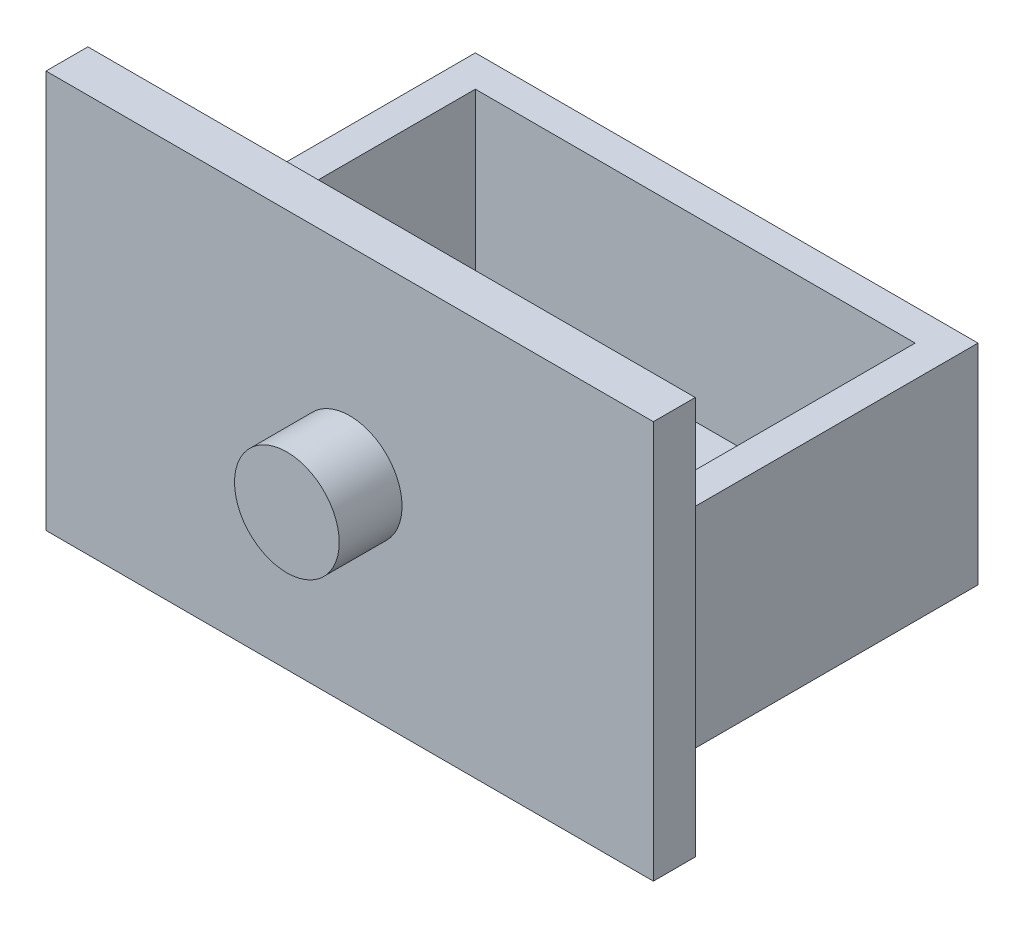
ISO-10303-21;
HEADER;
FILE_DESCRIPTION(('STEP AP214'),'2;1');
FILE_NAME('part.step','',(''),(''),'','','');
FILE_SCHEMA(('AUTOMOTIVE_DESIGN { 1 0 10303 214 1 1 1 1 }'));
ENDSEC;
DATA;
#1=APPLICATION_CONTEXT('core data for automotive mechanical design processes');
#2=APPLICATION_PROTOCOL_DEFINITION('international standard','automotive_design',2000,#1);
#3=PRODUCT_CONTEXT('',#1,'mechanical');
#4=PRODUCT('Part','Part','',(#3));
#5=PRODUCT_RELATED_PRODUCT_CATEGORY('part','',(#4));
#6=PRODUCT_DEFINITION_FORMATION('','',#4);
#7=PRODUCT_DEFINITION_CONTEXT('part definition',#1,'design');
#8=PRODUCT_DEFINITION('design','',#6,#7);
#9=PRODUCT_DEFINITION_SHAPE('','',#8);
#10=(LENGTH_UNIT() NAMED_UNIT(*) SI_UNIT(.MILLI.,.METRE.));
#11=(NAMED_UNIT(*) PLANE_ANGLE_UNIT() SI_UNIT($,.RADIAN.));
#12=(NAMED_UNIT(*) SI_UNIT($,.STERADIAN.) SOLID_ANGLE_UNIT());
#13=UNCERTAINTY_MEASURE_WITH_UNIT(LENGTH_MEASURE(1.E-05),#10,'distance_accuracy_value','');
#14=(GEOMETRIC_REPRESENTATION_CONTEXT(3) GLOBAL_UNCERTAINTY_ASSIGNED_CONTEXT((#13)) GLOBAL_UNIT_ASSIGNED_CONTEXT((#10,
#11,#12)) REPRESENTATION_CONTEXT('',''));
#15=CARTESIAN_POINT('',(0.,0.,0.));
#16=DIRECTION('',(0.,0.,1.));
#17=DIRECTION('',(1.,0.,0.));
#18=AXIS2_PLACEMENT_3D('',#15,#16,#17);
#19=CARTESIAN_POINT('',(14.5,-9.5,2.));
#20=DIRECTION('',(-1.,0.,0.));
#21=DIRECTION('',(0.,0.,1.));
#22=AXIS2_PLACEMENT_3D('',#19,#20,#21);
#23=PLANE('',#22);
#24=DIRECTION('',(0.,1.,0.));
#25=VECTOR('',#24,1.);
#26=CARTESIAN_POINT('',(14.5,-9.5,0.));
#27=LINE('',#26,#25);
#28=CARTESIAN_POINT('',(14.5,-9.5,0.));
#29=VERTEX_POINT('',#28);
#30=CARTESIAN_POINT('',(14.5,9.5,0.));
#31=VERTEX_POINT('',#30);
#32=EDGE_CURVE('E195',#29,#31,#27,.T.);
#33=ORIENTED_EDGE('',*,*,#32,.T.);
#34=DIRECTION('',(0.,0.,-1.));
#35=VECTOR('',#34,1.);
#36=CARTESIAN_POINT('',(14.5,9.5,2.));
#37=LINE('',#36,#35);
#38=CARTESIAN_POINT('',(14.5,9.5,2.));
#39=VERTEX_POINT('',#38);
#40=EDGE_CURVE('E44',#39,#31,#37,.T.);
#41=ORIENTED_EDGE('',*,*,#40,.F.);
#42=DIRECTION('',(0.,1.,0.));
#43=VECTOR('',#42,1.);
#44=CARTESIAN_POINT('',(14.5,-9.5,2.));
#45=LINE('',#44,#43);
#46=CARTESIAN_POINT('',(14.5,-9.5,2.));
#47=VERTEX_POINT('',#46);
#48=EDGE_CURVE('E196',#47,#39,#45,.T.);
#49=ORIENTED_EDGE('',*,*,#48,.F.);
#50=DIRECTION('',(0.,0.,-1.));
#51=VECTOR('',#50,1.);
#52=CARTESIAN_POINT('',(14.5,-9.5,2.));
#53=LINE('',#52,#51);
#54=EDGE_CURVE('E206',#47,#29,#53,.T.);
#55=ORIENTED_EDGE('',*,*,#54,.T.);
#56=EDGE_LOOP('',(#33,#41,#49,#55));
#57=FACE_BOUND('',#56,.T.);
#58=ADVANCED_FACE('F37',(#57),#23,.F.);
#59=CARTESIAN_POINT('',(-14.5,9.5,2.));
#60=DIRECTION('',(0.,-1.,0.));
#61=DIRECTION('',(0.,0.,-1.));
#62=AXIS2_PLACEMENT_3D('',#59,#60,#61);
#63=PLANE('',#62);
#64=DIRECTION('',(-1.,0.,0.));
#65=VECTOR('',#64,1.);
#66=CARTESIAN_POINT('',(-14.5,9.5,0.));
#67=LINE('',#66,#65);
#68=CARTESIAN_POINT('',(-14.5,9.5,0.));
#69=VERTEX_POINT('',#68);
#70=EDGE_CURVE('E209',#31,#69,#67,.T.);
#71=ORIENTED_EDGE('',*,*,#70,.T.);
#72=DIRECTION('',(0.,0.,-1.));
#73=VECTOR('',#72,1.);
#74=CARTESIAN_POINT('',(-14.5,9.5,2.));
#75=LINE('',#74,#73);
#76=CARTESIAN_POINT('',(-14.5,9.5,2.));
#77=VERTEX_POINT('',#76);
#78=EDGE_CURVE('E219',#77,#69,#75,.T.);
#79=ORIENTED_EDGE('',*,*,#78,.F.);
#80=DIRECTION('',(-1.,0.,0.));
#81=VECTOR('',#80,1.);
#82=CARTESIAN_POINT('',(-14.5,9.5,2.));
#83=LINE('',#82,#81);
#84=EDGE_CURVE('E199',#39,#77,#83,.T.);
#85=ORIENTED_EDGE('',*,*,#84,.F.);
#86=ORIENTED_EDGE('',*,*,#40,.T.);
#87=EDGE_LOOP('',(#71,#79,#85,#86));
#88=FACE_BOUND('',#87,.T.);
#89=ADVANCED_FACE('F224',(#88),#63,.F.);
#90=CARTESIAN_POINT('',(-14.5,-9.5,2.));
#91=DIRECTION('',(1.,0.,0.));
#92=DIRECTION('',(0.,0.,-1.));
#93=AXIS2_PLACEMENT_3D('',#90,#91,#92);
#94=PLANE('',#93);
#95=DIRECTION('',(0.,-1.,0.));
#96=VECTOR('',#95,1.);
#97=CARTESIAN_POINT('',(-14.5,-9.5,0.));
#98=LINE('',#97,#96);
#99=CARTESIAN_POINT('',(-14.5,-9.5,0.));
#100=VERTEX_POINT('',#99);
#101=EDGE_CURVE('E211',#69,#100,#98,.T.);
#102=ORIENTED_EDGE('',*,*,#101,.T.);
#103=DIRECTION('',(0.,0.,-1.));
#104=VECTOR('',#103,1.);
#105=CARTESIAN_POINT('',(-14.5,-9.5,2.));
#106=LINE('',#105,#104);
#107=CARTESIAN_POINT('',(-14.5,-9.5,2.));
#108=VERTEX_POINT('',#107);
#109=EDGE_CURVE('E216',#108,#100,#106,.T.);
#110=ORIENTED_EDGE('',*,*,#109,.F.);
#111=DIRECTION('',(0.,-1.,0.));
#112=VECTOR('',#111,1.);
#113=CARTESIAN_POINT('',(-14.5,-9.5,2.));
#114=LINE('',#113,#112);
#115=EDGE_CURVE('E202',#77,#108,#114,.T.);
#116=ORIENTED_EDGE('',*,*,#115,.F.);
#117=ORIENTED_EDGE('',*,*,#78,.T.);
#118=EDGE_LOOP('',(#102,#110,#116,#117));
#119=FACE_BOUND('',#118,.T.);
#120=ADVANCED_FACE('F236',(#119),#94,.F.);
#121=CARTESIAN_POINT('',(-14.5,-9.5,2.));
#122=DIRECTION('',(0.,1.,0.));
#123=DIRECTION('',(0.,0.,1.));
#124=AXIS2_PLACEMENT_3D('',#121,#122,#123);
#125=PLANE('',#124);
#126=DIRECTION('',(1.,0.,0.));
#127=VECTOR('',#126,1.);
#128=CARTESIAN_POINT('',(-14.5,-9.5,0.));
#129=LINE('',#128,#127);
#130=EDGE_CURVE('E200',#100,#29,#129,.T.);
#131=ORIENTED_EDGE('',*,*,#130,.T.);
#132=ORIENTED_EDGE('',*,*,#54,.F.);
#133=DIRECTION('',(1.,0.,0.));
#134=VECTOR('',#133,1.);
#135=CARTESIAN_POINT('',(-14.5,-9.5,2.));
#136=LINE('',#135,#134);
#137=EDGE_CURVE('E204',#108,#47,#136,.T.);
#138=ORIENTED_EDGE('',*,*,#137,.F.);
#139=ORIENTED_EDGE('',*,*,#109,.T.);
#140=EDGE_LOOP('',(#131,#132,#138,#139));
#141=FACE_BOUND('',#140,.T.);
#142=ADVANCED_FACE('F240',(#141),#125,.F.);
#143=CARTESIAN_POINT('',(0.,0.,2.));
#144=DIRECTION('',(0.,0.,-1.));
#145=DIRECTION('',(-1.,0.,0.));
#146=AXIS2_PLACEMENT_3D('',#143,#144,#145);
#147=PLANE('',#146);
#148=CARTESIAN_POINT('',(0.,0.,2.));
#149=DIRECTION('',(0.,0.,-1.));
#150=DIRECTION('',(-1.,0.,0.));
#151=AXIS2_PLACEMENT_3D('',#148,#149,#150);
#152=CIRCLE('',#151,2.5);
#153=CARTESIAN_POINT('',(-2.5,0.,2.));
#154=VERTEX_POINT('',#153);
#155=EDGE_CURVE('E11',#154,#154,#152,.F.);
#156=ORIENTED_EDGE('',*,*,#155,.F.);
#157=EDGE_LOOP('',(#156));
#158=FACE_BOUND('',#157,.T.);
#159=ORIENTED_EDGE('',*,*,#48,.T.);
#160=ORIENTED_EDGE('',*,*,#84,.T.);
#161=ORIENTED_EDGE('',*,*,#115,.T.);
#162=ORIENTED_EDGE('',*,*,#137,.T.);
#163=EDGE_LOOP('',(#159,#160,#161,#162));
#164=FACE_BOUND('',#163,.T.);
#165=ADVANCED_FACE('F242',(#158,#164),#147,.F.);
#166=CARTESIAN_POINT('',(0.,0.,0.));
#167=DIRECTION('',(0.,0.,-1.));
#168=DIRECTION('',(-1.,0.,0.));
#169=AXIS2_PLACEMENT_3D('',#166,#167,#168);
#170=PLANE('',#169);
#171=DIRECTION('',(0.,-1.,0.));
#172=VECTOR('',#171,1.);
#173=CARTESIAN_POINT('',(12.,2.5,0.));
#174=LINE('',#173,#172);
#175=CARTESIAN_POINT('',(12.,2.5,0.));
#176=VERTEX_POINT('',#175);
#177=CARTESIAN_POINT('',(12.,-7.5,0.));
#178=VERTEX_POINT('',#177);
#179=EDGE_CURVE('E59',#176,#178,#174,.T.);
#180=ORIENTED_EDGE('',*,*,#179,.F.);
#181=DIRECTION('',(1.,0.,0.));
#182=VECTOR('',#181,1.);
#183=CARTESIAN_POINT('',(12.,2.5,0.));
#184=LINE('',#183,#182);
#185=CARTESIAN_POINT('',(-12.,2.5,0.));
#186=VERTEX_POINT('',#185);
#187=EDGE_CURVE('E169',#186,#176,#184,.T.);
#188=ORIENTED_EDGE('',*,*,#187,.F.);
#189=DIRECTION('',(0.,1.,0.));
#190=VECTOR('',#189,1.);
#191=CARTESIAN_POINT('',(-12.,2.5,0.));
#192=LINE('',#191,#190);
#193=CARTESIAN_POINT('',(-12.,-7.5,0.));
#194=VERTEX_POINT('',#193);
#195=EDGE_CURVE('E180',#194,#186,#192,.T.);
#196=ORIENTED_EDGE('',*,*,#195,.F.);
#197=DIRECTION('',(-1.,0.,0.));
#198=VECTOR('',#197,1.);
#199=CARTESIAN_POINT('',(12.,-7.5,0.));
#200=LINE('',#199,#198);
#201=EDGE_CURVE('E177',#178,#194,#200,.T.);
#202=ORIENTED_EDGE('',*,*,#201,.F.);
#203=EDGE_LOOP('',(#180,#188,#196,#202));
#204=FACE_BOUND('',#203,.T.);
#205=ORIENTED_EDGE('',*,*,#32,.F.);
#206=ORIENTED_EDGE('',*,*,#130,.F.);
#207=ORIENTED_EDGE('',*,*,#101,.F.);
#208=ORIENTED_EDGE('',*,*,#70,.F.);
#209=EDGE_LOOP('',(#205,#206,#207,#208));
#210=FACE_BOUND('',#209,.T.);
#211=ADVANCED_FACE('F232',(#204,#210),#170,.T.);
#212=CARTESIAN_POINT('',(12.,2.5,-16.));
#213=DIRECTION('',(-1.,0.,0.));
#214=DIRECTION('',(0.,-1.,0.));
#215=AXIS2_PLACEMENT_3D('',#212,#213,#214);
#216=PLANE('',#215);
#217=ORIENTED_EDGE('',*,*,#179,.T.);
#218=DIRECTION('',(0.,0.,1.));
#219=VECTOR('',#218,1.);
#220=CARTESIAN_POINT('',(12.,-7.5,-16.));
#221=LINE('',#220,#219);
#222=CARTESIAN_POINT('',(12.,-7.5,-16.));
#223=VERTEX_POINT('',#222);
#224=EDGE_CURVE('E192',#223,#178,#221,.T.);
#225=ORIENTED_EDGE('',*,*,#224,.F.);
#226=DIRECTION('',(0.,-1.,0.));
#227=VECTOR('',#226,1.);
#228=CARTESIAN_POINT('',(12.,2.5,-16.));
#229=LINE('',#228,#227);
#230=CARTESIAN_POINT('',(12.,2.5,-16.));
#231=VERTEX_POINT('',#230);
#232=EDGE_CURVE('E165',#231,#223,#229,.T.);
#233=ORIENTED_EDGE('',*,*,#232,.F.);
#234=DIRECTION('',(0.,0.,1.));
#235=VECTOR('',#234,1.);
#236=CARTESIAN_POINT('',(12.,2.5,-16.));
#237=LINE('',#236,#235);
#238=EDGE_CURVE('E175',#231,#176,#237,.T.);
#239=ORIENTED_EDGE('',*,*,#238,.T.);
#240=EDGE_LOOP('',(#217,#225,#233,#239));
#241=FACE_BOUND('',#240,.T.);
#242=ADVANCED_FACE('F250',(#241),#216,.F.);
#243=CARTESIAN_POINT('',(12.,-7.5,-16.));
#244=DIRECTION('',(0.,1.,0.));
#245=DIRECTION('',(0.,0.,1.));
#246=AXIS2_PLACEMENT_3D('',#243,#244,#245);
#247=PLANE('',#246);
#248=ORIENTED_EDGE('',*,*,#201,.T.);
#249=DIRECTION('',(0.,0.,1.));
#250=VECTOR('',#249,1.);
#251=CARTESIAN_POINT('',(-12.,-7.5,-16.));
#252=LINE('',#251,#250);
#253=CARTESIAN_POINT('',(-12.,-7.5,-16.));
#254=VERTEX_POINT('',#253);
#255=EDGE_CURVE('E189',#254,#194,#252,.T.);
#256=ORIENTED_EDGE('',*,*,#255,.F.);
#257=DIRECTION('',(-1.,0.,0.));
#258=VECTOR('',#257,1.);
#259=CARTESIAN_POINT('',(12.,-7.5,-16.));
#260=LINE('',#259,#258);
#261=EDGE_CURVE('E168',#223,#254,#260,.T.);
#262=ORIENTED_EDGE('',*,*,#261,.F.);
#263=ORIENTED_EDGE('',*,*,#224,.T.);
#264=EDGE_LOOP('',(#248,#256,#262,#263));
#265=FACE_BOUND('',#264,.T.);
#266=ADVANCED_FACE('F285',(#265),#247,.F.);
#267=CARTESIAN_POINT('',(-12.,2.5,-16.));
#268=DIRECTION('',(1.,0.,0.));
#269=DIRECTION('',(0.,1.,0.));
#270=AXIS2_PLACEMENT_3D('',#267,#268,#269);
#271=PLANE('',#270);
#272=ORIENTED_EDGE('',*,*,#195,.T.);
#273=DIRECTION('',(0.,0.,1.));
#274=VECTOR('',#273,1.);
#275=CARTESIAN_POINT('',(-12.,2.5,-16.));
#276=LINE('',#275,#274);
#277=CARTESIAN_POINT('',(-12.,2.5,-16.));
#278=VERTEX_POINT('',#277);
#279=EDGE_CURVE('E186',#278,#186,#276,.T.);
#280=ORIENTED_EDGE('',*,*,#279,.F.);
#281=DIRECTION('',(0.,1.,0.));
#282=VECTOR('',#281,1.);
#283=CARTESIAN_POINT('',(-12.,2.5,-16.));
#284=LINE('',#283,#282);
#285=EDGE_CURVE('E171',#254,#278,#284,.T.);
#286=ORIENTED_EDGE('',*,*,#285,.F.);
#287=ORIENTED_EDGE('',*,*,#255,.T.);
#288=EDGE_LOOP('',(#272,#280,#286,#287));
#289=FACE_BOUND('',#288,.T.);
#290=ADVANCED_FACE('F294',(#289),#271,.F.);
#291=CARTESIAN_POINT('',(12.,2.5,-16.));
#292=DIRECTION('',(0.,-1.,0.));
#293=DIRECTION('',(0.,0.,-1.));
#294=AXIS2_PLACEMENT_3D('',#291,#292,#293);
#295=PLANE('',#294);
#296=DIRECTION('',(1.,0.,0.));
#297=VECTOR('',#296,1.);
#298=CARTESIAN_POINT('',(10.5,2.5,-1.5));
#299=LINE('',#298,#297);
#300=CARTESIAN_POINT('',(-10.5,2.5,-1.5));
#301=VERTEX_POINT('',#300);
#302=CARTESIAN_POINT('',(10.5,2.5,-1.5));
#303=VERTEX_POINT('',#302);
#304=EDGE_CURVE('E156',#301,#303,#299,.T.);
#305=ORIENTED_EDGE('',*,*,#304,.F.);
#306=DIRECTION('',(0.,0.,1.));
#307=VECTOR('',#306,1.);
#308=CARTESIAN_POINT('',(-10.5,2.5,-1.5));
#309=LINE('',#308,#307);
#310=CARTESIAN_POINT('',(-10.5,2.5,-14.5));
#311=VERTEX_POINT('',#310);
#312=EDGE_CURVE('E51',#311,#301,#309,.T.);
#313=ORIENTED_EDGE('',*,*,#312,.F.);
#314=DIRECTION('',(-1.,0.,0.));
#315=VECTOR('',#314,1.);
#316=CARTESIAN_POINT('',(-10.5,2.5,-14.5));
#317=LINE('',#316,#315);
#318=CARTESIAN_POINT('',(10.5,2.5,-14.5));
#319=VERTEX_POINT('',#318);
#320=EDGE_CURVE('E145',#319,#311,#317,.T.);
#321=ORIENTED_EDGE('',*,*,#320,.F.);
#322=DIRECTION('',(0.,0.,-1.));
#323=VECTOR('',#322,1.);
#324=CARTESIAN_POINT('',(10.5,2.5,-14.5));
#325=LINE('',#324,#323);
#326=EDGE_CURVE('E148',#303,#319,#325,.T.);
#327=ORIENTED_EDGE('',*,*,#326,.F.);
#328=EDGE_LOOP('',(#305,#313,#321,#327));
#329=FACE_BOUND('',#328,.T.);
#330=ORIENTED_EDGE('',*,*,#187,.T.);
#331=ORIENTED_EDGE('',*,*,#238,.F.);
#332=DIRECTION('',(1.,0.,0.));
#333=VECTOR('',#332,1.);
#334=CARTESIAN_POINT('',(12.,2.5,-16.));
#335=LINE('',#334,#333);
#336=EDGE_CURVE('E173',#278,#231,#335,.T.);
#337=ORIENTED_EDGE('',*,*,#336,.F.);
#338=ORIENTED_EDGE('',*,*,#279,.T.);
#339=EDGE_LOOP('',(#330,#331,#337,#338));
#340=FACE_BOUND('',#339,.T.);
#341=ADVANCED_FACE('F304',(#329,#340),#295,.F.);
#342=CARTESIAN_POINT('',(0.,0.,-16.));
#343=DIRECTION('',(0.,0.,-1.));
#344=DIRECTION('',(-1.,0.,0.));
#345=AXIS2_PLACEMENT_3D('',#342,#343,#344);
#346=PLANE('',#345);
#347=ORIENTED_EDGE('',*,*,#232,.T.);
#348=ORIENTED_EDGE('',*,*,#261,.T.);
#349=ORIENTED_EDGE('',*,*,#285,.T.);
#350=ORIENTED_EDGE('',*,*,#336,.T.);
#351=EDGE_LOOP('',(#347,#348,#349,#350));
#352=FACE_BOUND('',#351,.T.);
#353=ADVANCED_FACE('F312',(#352),#346,.T.);
#354=CARTESIAN_POINT('',(-10.5,-6.,-1.5));
#355=DIRECTION('',(-1.,0.,0.));
#356=DIRECTION('',(0.,0.,1.));
#357=AXIS2_PLACEMENT_3D('',#354,#355,#356);
#358=PLANE('',#357);
#359=ORIENTED_EDGE('',*,*,#312,.T.);
#360=DIRECTION('',(0.,1.,0.));
#361=VECTOR('',#360,1.);
#362=CARTESIAN_POINT('',(-10.5,-6.,-1.5));
#363=LINE('',#362,#361);
#364=CARTESIAN_POINT('',(-10.5,-6.,-1.5));
#365=VERTEX_POINT('',#364);
#366=EDGE_CURVE('E123',#365,#301,#363,.T.);
#367=ORIENTED_EDGE('',*,*,#366,.F.);
#368=DIRECTION('',(0.,0.,1.));
#369=VECTOR('',#368,1.);
#370=CARTESIAN_POINT('',(-10.5,-6.,-1.5));
#371=LINE('',#370,#369);
#372=CARTESIAN_POINT('',(-10.5,-6.,-14.5));
#373=VERTEX_POINT('',#372);
#374=EDGE_CURVE('E127',#373,#365,#371,.T.);
#375=ORIENTED_EDGE('',*,*,#374,.F.);
#376=DIRECTION('',(0.,1.,0.));
#377=VECTOR('',#376,1.);
#378=CARTESIAN_POINT('',(-10.5,-6.,-14.5));
#379=LINE('',#378,#377);
#380=EDGE_CURVE('E160',#373,#311,#379,.T.);
#381=ORIENTED_EDGE('',*,*,#380,.T.);
#382=EDGE_LOOP('',(#359,#367,#375,#381));
#383=FACE_BOUND('',#382,.T.);
#384=ADVANCED_FACE('F125',(#383),#358,.F.);
#385=CARTESIAN_POINT('',(-10.5,-6.,-14.5));
#386=DIRECTION('',(0.,0.,-1.));
#387=DIRECTION('',(-1.,0.,0.));
#388=AXIS2_PLACEMENT_3D('',#385,#386,#387);
#389=PLANE('',#388);
#390=ORIENTED_EDGE('',*,*,#320,.T.);
#391=ORIENTED_EDGE('',*,*,#380,.F.);
#392=DIRECTION('',(-1.,0.,0.));
#393=VECTOR('',#392,1.);
#394=CARTESIAN_POINT('',(-10.5,-6.,-14.5));
#395=LINE('',#394,#393);
#396=CARTESIAN_POINT('',(10.5,-6.,-14.5));
#397=VERTEX_POINT('',#396);
#398=EDGE_CURVE('E133',#397,#373,#395,.T.);
#399=ORIENTED_EDGE('',*,*,#398,.F.);
#400=DIRECTION('',(0.,1.,0.));
#401=VECTOR('',#400,1.);
#402=CARTESIAN_POINT('',(10.5,-6.,-14.5));
#403=LINE('',#402,#401);
#404=EDGE_CURVE('E162',#397,#319,#403,.T.);
#405=ORIENTED_EDGE('',*,*,#404,.T.);
#406=EDGE_LOOP('',(#390,#391,#399,#405));
#407=FACE_BOUND('',#406,.T.);
#408=ADVANCED_FACE('F333',(#407),#389,.F.);
#409=CARTESIAN_POINT('',(10.5,-6.,-14.5));
#410=DIRECTION('',(1.,0.,0.));
#411=DIRECTION('',(0.,0.,-1.));
#412=AXIS2_PLACEMENT_3D('',#409,#410,#411);
#413=PLANE('',#412);
#414=ORIENTED_EDGE('',*,*,#326,.T.);
#415=ORIENTED_EDGE('',*,*,#404,.F.);
#416=DIRECTION('',(0.,0.,-1.));
#417=VECTOR('',#416,1.);
#418=CARTESIAN_POINT('',(10.5,-6.,-14.5));
#419=LINE('',#418,#417);
#420=CARTESIAN_POINT('',(10.5,-6.,-1.5));
#421=VERTEX_POINT('',#420);
#422=EDGE_CURVE('E141',#421,#397,#419,.T.);
#423=ORIENTED_EDGE('',*,*,#422,.F.);
#424=DIRECTION('',(0.,1.,0.));
#425=VECTOR('',#424,1.);
#426=CARTESIAN_POINT('',(10.5,-6.,-1.5));
#427=LINE('',#426,#425);
#428=EDGE_CURVE('E132',#421,#303,#427,.T.);
#429=ORIENTED_EDGE('',*,*,#428,.T.);
#430=EDGE_LOOP('',(#414,#415,#423,#429));
#431=FACE_BOUND('',#430,.T.);
#432=ADVANCED_FACE('F342',(#431),#413,.F.);
#433=CARTESIAN_POINT('',(10.5,-6.,-1.5));
#434=DIRECTION('',(0.,0.,1.));
#435=DIRECTION('',(1.,0.,0.));
#436=AXIS2_PLACEMENT_3D('',#433,#434,#435);
#437=PLANE('',#436);
#438=ORIENTED_EDGE('',*,*,#304,.T.);
#439=ORIENTED_EDGE('',*,*,#428,.F.);
#440=DIRECTION('',(1.,0.,0.));
#441=VECTOR('',#440,1.);
#442=CARTESIAN_POINT('',(10.5,-6.,-1.5));
#443=LINE('',#442,#441);
#444=EDGE_CURVE('E136',#365,#421,#443,.T.);
#445=ORIENTED_EDGE('',*,*,#444,.F.);
#446=ORIENTED_EDGE('',*,*,#366,.T.);
#447=EDGE_LOOP('',(#438,#439,#445,#446));
#448=FACE_BOUND('',#447,.T.);
#449=ADVANCED_FACE('F137',(#448),#437,.F.);
#450=CARTESIAN_POINT('',(0.,-6.,0.));
#451=DIRECTION('',(0.,-1.,0.));
#452=DIRECTION('',(0.,0.,-1.));
#453=AXIS2_PLACEMENT_3D('',#450,#451,#452);
#454=PLANE('',#453);
#455=ORIENTED_EDGE('',*,*,#374,.T.);
#456=ORIENTED_EDGE('',*,*,#444,.T.);
#457=ORIENTED_EDGE('',*,*,#422,.T.);
#458=ORIENTED_EDGE('',*,*,#398,.T.);
#459=EDGE_LOOP('',(#455,#456,#457,#458));
#460=FACE_BOUND('',#459,.T.);
#461=ADVANCED_FACE('F143',(#460),#454,.F.);
#462=CARTESIAN_POINT('',(0.,0.,5.));
#463=DIRECTION('',(0.,0.,-1.));
#464=DIRECTION('',(-1.,0.,0.));
#465=AXIS2_PLACEMENT_3D('',#462,#463,#464);
#466=CYLINDRICAL_SURFACE('',#465,2.5);
#467=CARTESIAN_POINT('',(0.,0.,5.));
#468=DIRECTION('',(0.,0.,1.));
#469=DIRECTION('',(1.,0.,0.));
#470=AXIS2_PLACEMENT_3D('',#467,#468,#469);
#471=CIRCLE('',#470,2.5);
#472=CARTESIAN_POINT('',(2.5,0.,5.));
#473=VERTEX_POINT('',#472);
#474=EDGE_CURVE('E151',#473,#473,#471,.T.);
#475=ORIENTED_EDGE('',*,*,#474,.F.);
#476=EDGE_LOOP('',(#475));
#477=FACE_BOUND('',#476,.T.);
#478=ORIENTED_EDGE('',*,*,#155,.T.);
#479=EDGE_LOOP('',(#478));
#480=FACE_BOUND('',#479,.T.);
#481=ADVANCED_FACE('F368',(#477,#480),#466,.T.);
#482=CARTESIAN_POINT('',(0.,0.,5.));
#483=DIRECTION('',(0.,0.,1.));
#484=DIRECTION('',(1.,0.,0.));
#485=AXIS2_PLACEMENT_3D('',#482,#483,#484);
#486=PLANE('',#485);
#487=ORIENTED_EDGE('',*,*,#474,.T.);
#488=EDGE_LOOP('',(#487));
#489=FACE_BOUND('',#488,.T.);
#490=ADVANCED_FACE('F381',(#489),#486,.T.);
#491=CLOSED_SHELL('',(#58,#89,#120,#142,#165,#211,#242,#266,#290,#341,#353,#384,#408,#432,#449,
#461,#481,#490));
#492=MANIFOLD_SOLID_BREP('B2',#491);
#493=ADVANCED_BREP_SHAPE_REPRESENTATION('',(#18,#492),#14);
#494=SHAPE_DEFINITION_REPRESENTATION(#9,#493);
ENDSEC;
END-ISO-10303-21;
